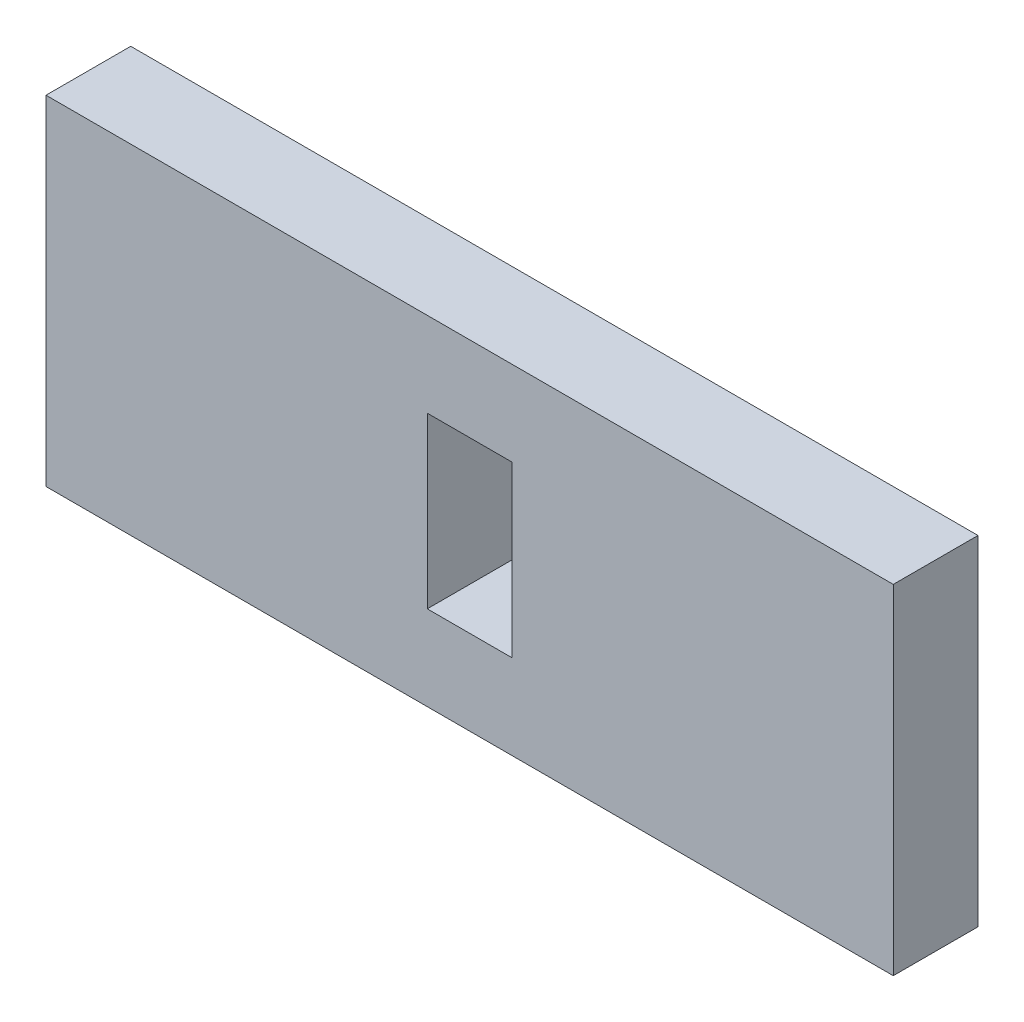
ISO-10303-21;
HEADER;
FILE_DESCRIPTION(('STEP AP214'),'2;1');
FILE_NAME('part.step','',(''),(''),'','','');
FILE_SCHEMA(('AUTOMOTIVE_DESIGN { 1 0 10303 214 1 1 1 1 }'));
ENDSEC;
DATA;
#1=APPLICATION_CONTEXT('core data for automotive mechanical design processes');
#2=APPLICATION_PROTOCOL_DEFINITION('international standard','automotive_design',2000,#1);
#3=PRODUCT_CONTEXT('',#1,'mechanical');
#4=PRODUCT('Part','Part','',(#3));
#5=PRODUCT_RELATED_PRODUCT_CATEGORY('part','',(#4));
#6=PRODUCT_DEFINITION_FORMATION('','',#4);
#7=PRODUCT_DEFINITION_CONTEXT('part definition',#1,'design');
#8=PRODUCT_DEFINITION('design','',#6,#7);
#9=PRODUCT_DEFINITION_SHAPE('','',#8);
#10=(LENGTH_UNIT() NAMED_UNIT(*) SI_UNIT(.MILLI.,.METRE.));
#11=(NAMED_UNIT(*) PLANE_ANGLE_UNIT() SI_UNIT($,.RADIAN.));
#12=(NAMED_UNIT(*) SI_UNIT($,.STERADIAN.) SOLID_ANGLE_UNIT());
#13=UNCERTAINTY_MEASURE_WITH_UNIT(LENGTH_MEASURE(1.E-05),#10,'distance_accuracy_value','');
#14=(GEOMETRIC_REPRESENTATION_CONTEXT(3) GLOBAL_UNCERTAINTY_ASSIGNED_CONTEXT((#13)) GLOBAL_UNIT_ASSIGNED_CONTEXT((#10,
#11,#12)) REPRESENTATION_CONTEXT('',''));
#15=CARTESIAN_POINT('',(0.,0.,0.));
#16=DIRECTION('',(0.,0.,1.));
#17=DIRECTION('',(1.,0.,0.));
#18=AXIS2_PLACEMENT_3D('',#15,#16,#17);
#19=CARTESIAN_POINT('',(0.,0.,5.));
#20=DIRECTION('',(0.,0.,-1.));
#21=DIRECTION('',(-1.,0.,0.));
#22=AXIS2_PLACEMENT_3D('',#19,#20,#21);
#23=PLANE('',#22);
#24=DIRECTION('',(0.,1.,0.));
#25=VECTOR('',#24,1.);
#26=CARTESIAN_POINT('',(0.,0.,5.));
#27=LINE('',#26,#25);
#28=CARTESIAN_POINT('',(0.,-20.,5.));
#29=VERTEX_POINT('',#28);
#30=CARTESIAN_POINT('',(0.,0.,5.));
#31=VERTEX_POINT('',#30);
#32=EDGE_CURVE('E134',#29,#31,#27,.T.);
#33=ORIENTED_EDGE('',*,*,#32,.T.);
#34=DIRECTION('',(-1.,0.,0.));
#35=VECTOR('',#34,1.);
#36=CARTESIAN_POINT('',(0.,0.,5.));
#37=LINE('',#36,#35);
#38=CARTESIAN_POINT('',(-50.,0.,5.));
#39=VERTEX_POINT('',#38);
#40=EDGE_CURVE('E137',#31,#39,#37,.T.);
#41=ORIENTED_EDGE('',*,*,#40,.T.);
#42=DIRECTION('',(0.,-1.,0.));
#43=VECTOR('',#42,1.);
#44=CARTESIAN_POINT('',(-50.,0.,5.));
#45=LINE('',#44,#43);
#46=CARTESIAN_POINT('',(-50.,-20.,5.));
#47=VERTEX_POINT('',#46);
#48=EDGE_CURVE('E140',#39,#47,#45,.T.);
#49=ORIENTED_EDGE('',*,*,#48,.T.);
#50=DIRECTION('',(1.,0.,0.));
#51=VECTOR('',#50,1.);
#52=CARTESIAN_POINT('',(0.,-20.,5.));
#53=LINE('',#52,#51);
#54=EDGE_CURVE('E142',#47,#29,#53,.T.);
#55=ORIENTED_EDGE('',*,*,#54,.T.);
#56=EDGE_LOOP('',(#33,#41,#49,#55));
#57=FACE_BOUND('',#56,.T.);
#58=DIRECTION('',(0.,1.,0.));
#59=VECTOR('',#58,1.);
#60=CARTESIAN_POINT('',(-22.5,-15.,5.));
#61=LINE('',#60,#59);
#62=CARTESIAN_POINT('',(-22.5,-15.,5.));
#63=VERTEX_POINT('',#62);
#64=CARTESIAN_POINT('',(-22.5,-5.,5.));
#65=VERTEX_POINT('',#64);
#66=EDGE_CURVE('E98',#63,#65,#61,.T.);
#67=ORIENTED_EDGE('',*,*,#66,.F.);
#68=DIRECTION('',(1.,0.,0.));
#69=VECTOR('',#68,1.);
#70=CARTESIAN_POINT('',(-27.5,-15.,5.));
#71=LINE('',#70,#69);
#72=CARTESIAN_POINT('',(-27.5,-15.,5.));
#73=VERTEX_POINT('',#72);
#74=EDGE_CURVE('E120',#73,#63,#71,.T.);
#75=ORIENTED_EDGE('',*,*,#74,.F.);
#76=DIRECTION('',(0.,-1.,0.));
#77=VECTOR('',#76,1.);
#78=CARTESIAN_POINT('',(-27.5,-15.,5.));
#79=LINE('',#78,#77);
#80=CARTESIAN_POINT('',(-27.5,-5.,5.));
#81=VERTEX_POINT('',#80);
#82=EDGE_CURVE('E118',#81,#73,#79,.T.);
#83=ORIENTED_EDGE('',*,*,#82,.F.);
#84=DIRECTION('',(-1.,0.,0.));
#85=VECTOR('',#84,1.);
#86=CARTESIAN_POINT('',(-27.5,-5.,5.));
#87=LINE('',#86,#85);
#88=EDGE_CURVE('E106',#65,#81,#87,.T.);
#89=ORIENTED_EDGE('',*,*,#88,.F.);
#90=EDGE_LOOP('',(#67,#75,#83,#89));
#91=FACE_BOUND('',#90,.T.);
#92=ADVANCED_FACE('F33',(#57,#91),#23,.F.);
#93=CARTESIAN_POINT('',(0.,0.,0.));
#94=DIRECTION('',(0.,0.,-1.));
#95=DIRECTION('',(-1.,0.,0.));
#96=AXIS2_PLACEMENT_3D('',#93,#94,#95);
#97=PLANE('',#96);
#98=DIRECTION('',(0.,1.,0.));
#99=VECTOR('',#98,1.);
#100=CARTESIAN_POINT('',(0.,0.,0.));
#101=LINE('',#100,#99);
#102=CARTESIAN_POINT('',(0.,-20.,0.));
#103=VERTEX_POINT('',#102);
#104=CARTESIAN_POINT('',(0.,0.,0.));
#105=VERTEX_POINT('',#104);
#106=EDGE_CURVE('E114',#103,#105,#101,.T.);
#107=ORIENTED_EDGE('',*,*,#106,.F.);
#108=DIRECTION('',(1.,0.,0.));
#109=VECTOR('',#108,1.);
#110=CARTESIAN_POINT('',(0.,-20.,0.));
#111=LINE('',#110,#109);
#112=CARTESIAN_POINT('',(-50.,-20.,0.));
#113=VERTEX_POINT('',#112);
#114=EDGE_CURVE('E138',#113,#103,#111,.T.);
#115=ORIENTED_EDGE('',*,*,#114,.F.);
#116=DIRECTION('',(0.,-1.,0.));
#117=VECTOR('',#116,1.);
#118=CARTESIAN_POINT('',(-50.,0.,0.));
#119=LINE('',#118,#117);
#120=CARTESIAN_POINT('',(-50.,0.,0.));
#121=VERTEX_POINT('',#120);
#122=EDGE_CURVE('E149',#121,#113,#119,.T.);
#123=ORIENTED_EDGE('',*,*,#122,.F.);
#124=DIRECTION('',(-1.,0.,0.));
#125=VECTOR('',#124,1.);
#126=CARTESIAN_POINT('',(0.,0.,0.));
#127=LINE('',#126,#125);
#128=EDGE_CURVE('E147',#105,#121,#127,.T.);
#129=ORIENTED_EDGE('',*,*,#128,.F.);
#130=EDGE_LOOP('',(#107,#115,#123,#129));
#131=FACE_BOUND('',#130,.T.);
#132=DIRECTION('',(1.,0.,0.));
#133=VECTOR('',#132,1.);
#134=CARTESIAN_POINT('',(-27.5,-15.,0.));
#135=LINE('',#134,#133);
#136=CARTESIAN_POINT('',(-27.5,-15.,0.));
#137=VERTEX_POINT('',#136);
#138=CARTESIAN_POINT('',(-22.5,-15.,0.));
#139=VERTEX_POINT('',#138);
#140=EDGE_CURVE('E107',#137,#139,#135,.T.);
#141=ORIENTED_EDGE('',*,*,#140,.T.);
#142=DIRECTION('',(0.,1.,0.));
#143=VECTOR('',#142,1.);
#144=CARTESIAN_POINT('',(-22.5,-15.,0.));
#145=LINE('',#144,#143);
#146=CARTESIAN_POINT('',(-22.5,-5.,0.));
#147=VERTEX_POINT('',#146);
#148=EDGE_CURVE('E56',#139,#147,#145,.T.);
#149=ORIENTED_EDGE('',*,*,#148,.T.);
#150=DIRECTION('',(-1.,0.,0.));
#151=VECTOR('',#150,1.);
#152=CARTESIAN_POINT('',(-27.5,-5.,0.));
#153=LINE('',#152,#151);
#154=CARTESIAN_POINT('',(-27.5,-5.,0.));
#155=VERTEX_POINT('',#154);
#156=EDGE_CURVE('E113',#147,#155,#153,.T.);
#157=ORIENTED_EDGE('',*,*,#156,.T.);
#158=DIRECTION('',(0.,-1.,0.));
#159=VECTOR('',#158,1.);
#160=CARTESIAN_POINT('',(-27.5,-15.,0.));
#161=LINE('',#160,#159);
#162=EDGE_CURVE('E126',#155,#137,#161,.T.);
#163=ORIENTED_EDGE('',*,*,#162,.T.);
#164=EDGE_LOOP('',(#141,#149,#157,#163));
#165=FACE_BOUND('',#164,.T.);
#166=ADVANCED_FACE('F167',(#131,#165),#97,.T.);
#167=CARTESIAN_POINT('',(0.,0.,5.));
#168=DIRECTION('',(-1.,0.,0.));
#169=DIRECTION('',(0.,0.,1.));
#170=AXIS2_PLACEMENT_3D('',#167,#168,#169);
#171=PLANE('',#170);
#172=ORIENTED_EDGE('',*,*,#106,.T.);
#173=DIRECTION('',(0.,0.,-1.));
#174=VECTOR('',#173,1.);
#175=CARTESIAN_POINT('',(0.,0.,5.));
#176=LINE('',#175,#174);
#177=EDGE_CURVE('E11',#31,#105,#176,.T.);
#178=ORIENTED_EDGE('',*,*,#177,.F.);
#179=ORIENTED_EDGE('',*,*,#32,.F.);
#180=DIRECTION('',(0.,0.,-1.));
#181=VECTOR('',#180,1.);
#182=CARTESIAN_POINT('',(0.,-20.,5.));
#183=LINE('',#182,#181);
#184=EDGE_CURVE('E144',#29,#103,#183,.T.);
#185=ORIENTED_EDGE('',*,*,#184,.T.);
#186=EDGE_LOOP('',(#172,#178,#179,#185));
#187=FACE_BOUND('',#186,.T.);
#188=ADVANCED_FACE('F35',(#187),#171,.F.);
#189=CARTESIAN_POINT('',(0.,0.,5.));
#190=DIRECTION('',(0.,-1.,0.));
#191=DIRECTION('',(0.,0.,-1.));
#192=AXIS2_PLACEMENT_3D('',#189,#190,#191);
#193=PLANE('',#192);
#194=ORIENTED_EDGE('',*,*,#128,.T.);
#195=DIRECTION('',(0.,0.,-1.));
#196=VECTOR('',#195,1.);
#197=CARTESIAN_POINT('',(-50.,0.,5.));
#198=LINE('',#197,#196);
#199=EDGE_CURVE('E41',#39,#121,#198,.T.);
#200=ORIENTED_EDGE('',*,*,#199,.F.);
#201=ORIENTED_EDGE('',*,*,#40,.F.);
#202=ORIENTED_EDGE('',*,*,#177,.T.);
#203=EDGE_LOOP('',(#194,#200,#201,#202));
#204=FACE_BOUND('',#203,.T.);
#205=ADVANCED_FACE('F177',(#204),#193,.F.);
#206=CARTESIAN_POINT('',(-50.,0.,5.));
#207=DIRECTION('',(1.,0.,0.));
#208=DIRECTION('',(0.,0.,-1.));
#209=AXIS2_PLACEMENT_3D('',#206,#207,#208);
#210=PLANE('',#209);
#211=ORIENTED_EDGE('',*,*,#122,.T.);
#212=DIRECTION('',(0.,0.,-1.));
#213=VECTOR('',#212,1.);
#214=CARTESIAN_POINT('',(-50.,-20.,5.));
#215=LINE('',#214,#213);
#216=EDGE_CURVE('E154',#47,#113,#215,.T.);
#217=ORIENTED_EDGE('',*,*,#216,.F.);
#218=ORIENTED_EDGE('',*,*,#48,.F.);
#219=ORIENTED_EDGE('',*,*,#199,.T.);
#220=EDGE_LOOP('',(#211,#217,#218,#219));
#221=FACE_BOUND('',#220,.T.);
#222=ADVANCED_FACE('F161',(#221),#210,.F.);
#223=CARTESIAN_POINT('',(0.,-20.,5.));
#224=DIRECTION('',(0.,1.,0.));
#225=DIRECTION('',(0.,0.,1.));
#226=AXIS2_PLACEMENT_3D('',#223,#224,#225);
#227=PLANE('',#226);
#228=ORIENTED_EDGE('',*,*,#114,.T.);
#229=ORIENTED_EDGE('',*,*,#184,.F.);
#230=ORIENTED_EDGE('',*,*,#54,.F.);
#231=ORIENTED_EDGE('',*,*,#216,.T.);
#232=EDGE_LOOP('',(#228,#229,#230,#231));
#233=FACE_BOUND('',#232,.T.);
#234=ADVANCED_FACE('F171',(#233),#227,.F.);
#235=CARTESIAN_POINT('',(-22.5,-15.,5.));
#236=DIRECTION('',(-1.,0.,0.));
#237=DIRECTION('',(0.,0.,1.));
#238=AXIS2_PLACEMENT_3D('',#235,#236,#237);
#239=PLANE('',#238);
#240=ORIENTED_EDGE('',*,*,#148,.F.);
#241=DIRECTION('',(0.,0.,-1.));
#242=VECTOR('',#241,1.);
#243=CARTESIAN_POINT('',(-22.5,-15.,5.));
#244=LINE('',#243,#242);
#245=EDGE_CURVE('E102',#63,#139,#244,.T.);
#246=ORIENTED_EDGE('',*,*,#245,.F.);
#247=ORIENTED_EDGE('',*,*,#66,.T.);
#248=DIRECTION('',(0.,0.,-1.));
#249=VECTOR('',#248,1.);
#250=CARTESIAN_POINT('',(-22.5,-5.,5.));
#251=LINE('',#250,#249);
#252=EDGE_CURVE('E101',#65,#147,#251,.T.);
#253=ORIENTED_EDGE('',*,*,#252,.T.);
#254=EDGE_LOOP('',(#240,#246,#247,#253));
#255=FACE_BOUND('',#254,.T.);
#256=ADVANCED_FACE('F100',(#255),#239,.T.);
#257=CARTESIAN_POINT('',(-27.5,-5.,5.));
#258=DIRECTION('',(0.,-1.,0.));
#259=DIRECTION('',(0.,0.,-1.));
#260=AXIS2_PLACEMENT_3D('',#257,#258,#259);
#261=PLANE('',#260);
#262=ORIENTED_EDGE('',*,*,#156,.F.);
#263=ORIENTED_EDGE('',*,*,#252,.F.);
#264=ORIENTED_EDGE('',*,*,#88,.T.);
#265=DIRECTION('',(0.,0.,-1.));
#266=VECTOR('',#265,1.);
#267=CARTESIAN_POINT('',(-27.5,-5.,5.));
#268=LINE('',#267,#266);
#269=EDGE_CURVE('E115',#81,#155,#268,.T.);
#270=ORIENTED_EDGE('',*,*,#269,.T.);
#271=EDGE_LOOP('',(#262,#263,#264,#270));
#272=FACE_BOUND('',#271,.T.);
#273=ADVANCED_FACE('F110',(#272),#261,.T.);
#274=CARTESIAN_POINT('',(-27.5,-15.,5.));
#275=DIRECTION('',(1.,0.,0.));
#276=DIRECTION('',(0.,0.,-1.));
#277=AXIS2_PLACEMENT_3D('',#274,#275,#276);
#278=PLANE('',#277);
#279=ORIENTED_EDGE('',*,*,#162,.F.);
#280=ORIENTED_EDGE('',*,*,#269,.F.);
#281=ORIENTED_EDGE('',*,*,#82,.T.);
#282=DIRECTION('',(0.,0.,-1.));
#283=VECTOR('',#282,1.);
#284=CARTESIAN_POINT('',(-27.5,-15.,5.));
#285=LINE('',#284,#283);
#286=EDGE_CURVE('E48',#73,#137,#285,.T.);
#287=ORIENTED_EDGE('',*,*,#286,.T.);
#288=EDGE_LOOP('',(#279,#280,#281,#287));
#289=FACE_BOUND('',#288,.T.);
#290=ADVANCED_FACE('F200',(#289),#278,.T.);
#291=CARTESIAN_POINT('',(-27.5,-15.,5.));
#292=DIRECTION('',(0.,1.,0.));
#293=DIRECTION('',(0.,0.,1.));
#294=AXIS2_PLACEMENT_3D('',#291,#292,#293);
#295=PLANE('',#294);
#296=ORIENTED_EDGE('',*,*,#140,.F.);
#297=ORIENTED_EDGE('',*,*,#286,.F.);
#298=ORIENTED_EDGE('',*,*,#74,.T.);
#299=ORIENTED_EDGE('',*,*,#245,.T.);
#300=EDGE_LOOP('',(#296,#297,#298,#299));
#301=FACE_BOUND('',#300,.T.);
#302=ADVANCED_FACE('F204',(#301),#295,.T.);
#303=CLOSED_SHELL('',(#92,#166,#188,#205,#222,#234,#256,#273,#290,#302));
#304=MANIFOLD_SOLID_BREP('B2',#303);
#305=ADVANCED_BREP_SHAPE_REPRESENTATION('',(#18,#304),#14);
#306=SHAPE_DEFINITION_REPRESENTATION(#9,#305);
ENDSEC;
END-ISO-10303-21;
